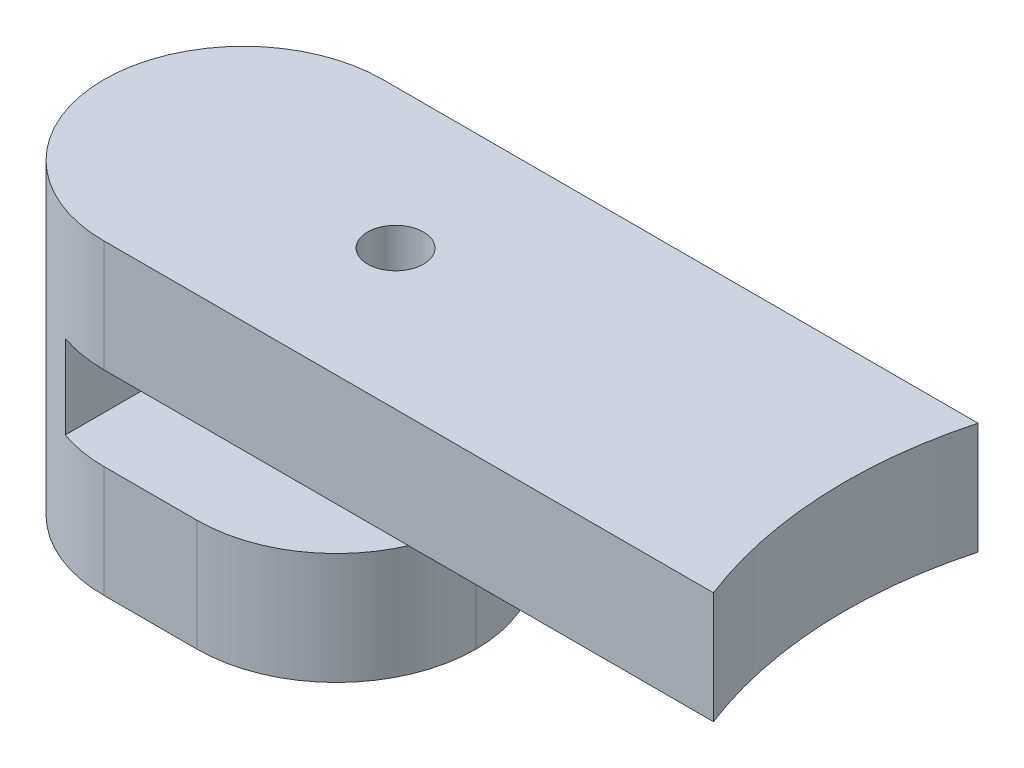
ISO-10303-21;
HEADER;
FILE_DESCRIPTION(('STEP AP214'),'2;1');
FILE_NAME('part.step','',(''),(''),'','','');
FILE_SCHEMA(('AUTOMOTIVE_DESIGN { 1 0 10303 214 1 1 1 1 }'));
ENDSEC;
DATA;
#1=APPLICATION_CONTEXT('core data for automotive mechanical design processes');
#2=APPLICATION_PROTOCOL_DEFINITION('international standard','automotive_design',2000,#1);
#3=PRODUCT_CONTEXT('',#1,'mechanical');
#4=PRODUCT('Part','Part','',(#3));
#5=PRODUCT_RELATED_PRODUCT_CATEGORY('part','',(#4));
#6=PRODUCT_DEFINITION_FORMATION('','',#4);
#7=PRODUCT_DEFINITION_CONTEXT('part definition',#1,'design');
#8=PRODUCT_DEFINITION('design','',#6,#7);
#9=PRODUCT_DEFINITION_SHAPE('','',#8);
#10=(LENGTH_UNIT() NAMED_UNIT(*) SI_UNIT(.MILLI.,.METRE.));
#11=(NAMED_UNIT(*) PLANE_ANGLE_UNIT() SI_UNIT($,.RADIAN.));
#12=(NAMED_UNIT(*) SI_UNIT($,.STERADIAN.) SOLID_ANGLE_UNIT());
#13=UNCERTAINTY_MEASURE_WITH_UNIT(LENGTH_MEASURE(1.E-05),#10,'distance_accuracy_value','');
#14=(GEOMETRIC_REPRESENTATION_CONTEXT(3) GLOBAL_UNCERTAINTY_ASSIGNED_CONTEXT((#13)) GLOBAL_UNIT_ASSIGNED_CONTEXT((#10,
#11,#12)) REPRESENTATION_CONTEXT('',''));
#15=CARTESIAN_POINT('',(0.,0.,0.));
#16=DIRECTION('',(0.,0.,1.));
#17=DIRECTION('',(1.,0.,0.));
#18=AXIS2_PLACEMENT_3D('',#15,#16,#17);
#19=CARTESIAN_POINT('',(0.,3.,3.75));
#20=DIRECTION('',(0.,0.,-1.));
#21=DIRECTION('',(-1.,0.,0.));
#22=AXIS2_PLACEMENT_3D('',#19,#20,#21);
#23=PLANE('',#22);
#24=DIRECTION('',(1.,0.,0.));
#25=VECTOR('',#24,1.);
#26=CARTESIAN_POINT('',(0.,3.,3.75));
#27=LINE('',#26,#25);
#28=CARTESIAN_POINT('',(-4.08744893904425,3.,3.75));
#29=VERTEX_POINT('',#28);
#30=CARTESIAN_POINT('',(12.29141362688,3.,3.75));
#31=VERTEX_POINT('',#30);
#32=EDGE_CURVE('E132',#29,#31,#27,.T.);
#33=ORIENTED_EDGE('',*,*,#32,.F.);
#34=DIRECTION('',(0.,1.,0.));
#35=VECTOR('',#34,1.);
#36=CARTESIAN_POINT('',(-4.08744893904425,-5.25,3.75));
#37=LINE('',#36,#35);
#38=CARTESIAN_POINT('',(-4.08744893904425,0.,3.75));
#39=VERTEX_POINT('',#38);
#40=EDGE_CURVE('E186',#29,#39,#37,.F.);
#41=ORIENTED_EDGE('',*,*,#40,.T.);
#42=DIRECTION('',(1.,0.,0.));
#43=VECTOR('',#42,1.);
#44=CARTESIAN_POINT('',(0.,0.,3.75));
#45=LINE('',#44,#43);
#46=CARTESIAN_POINT('',(12.29141362688,0.,3.75));
#47=VERTEX_POINT('',#46);
#48=EDGE_CURVE('E133',#39,#47,#45,.T.);
#49=ORIENTED_EDGE('',*,*,#48,.T.);
#50=DIRECTION('',(0.,1.,0.));
#51=VECTOR('',#50,1.);
#52=CARTESIAN_POINT('',(12.29141362688,-33.9411254969543,3.75));
#53=LINE('',#52,#51);
#54=EDGE_CURVE('E143',#47,#31,#53,.T.);
#55=ORIENTED_EDGE('',*,*,#54,.T.);
#56=EDGE_LOOP('',(#33,#41,#49,#55));
#57=FACE_BOUND('',#56,.T.);
#58=ADVANCED_FACE('F34',(#57),#23,.F.);
#59=CARTESIAN_POINT('',(0.,3.,-3.75));
#60=DIRECTION('',(0.,0.,-1.));
#61=DIRECTION('',(-1.,0.,0.));
#62=AXIS2_PLACEMENT_3D('',#59,#60,#61);
#63=PLANE('',#62);
#64=DIRECTION('',(-1.,0.,0.));
#65=VECTOR('',#64,1.);
#66=CARTESIAN_POINT('',(2.16255106095575,-2.25,-3.75));
#67=LINE('',#66,#65);
#68=CARTESIAN_POINT('',(-1.58744893904425,-2.25,-3.75));
#69=VERTEX_POINT('',#68);
#70=CARTESIAN_POINT('',(-4.08744893904426,-2.25,-3.75));
#71=VERTEX_POINT('',#70);
#72=EDGE_CURVE('E233',#69,#71,#67,.T.);
#73=ORIENTED_EDGE('',*,*,#72,.F.);
#74=DIRECTION('',(0.,1.,0.));
#75=VECTOR('',#74,1.);
#76=CARTESIAN_POINT('',(-1.58744893904425,-5.25,-3.75));
#77=LINE('',#76,#75);
#78=CARTESIAN_POINT('',(-1.58744893904425,-5.25,-3.74999999999999));
#79=VERTEX_POINT('',#78);
#80=EDGE_CURVE('E173',#69,#79,#77,.F.);
#81=ORIENTED_EDGE('',*,*,#80,.T.);
#82=DIRECTION('',(1.,0.,0.));
#83=VECTOR('',#82,1.);
#84=CARTESIAN_POINT('',(-7.83744893904425,-5.25,-3.75));
#85=LINE('',#84,#83);
#86=CARTESIAN_POINT('',(-4.08744893904426,-5.25,-3.75));
#87=VERTEX_POINT('',#86);
#88=EDGE_CURVE('E222',#87,#79,#85,.T.);
#89=ORIENTED_EDGE('',*,*,#88,.F.);
#90=DIRECTION('',(0.,1.,0.));
#91=VECTOR('',#90,1.);
#92=CARTESIAN_POINT('',(-4.08744893904426,3.,-3.75));
#93=LINE('',#92,#91);
#94=EDGE_CURVE('E171',#87,#71,#93,.T.);
#95=ORIENTED_EDGE('',*,*,#94,.T.);
#96=EDGE_LOOP('',(#73,#81,#89,#95));
#97=FACE_BOUND('',#96,.T.);
#98=ADVANCED_FACE('F226',(#97),#63,.T.);
#99=CARTESIAN_POINT('',(-5.33744893904425,-5.25,3.75));
#100=DIRECTION('',(-1.,0.,0.));
#101=DIRECTION('',(0.,0.,1.));
#102=AXIS2_PLACEMENT_3D('',#99,#100,#101);
#103=PLANE('',#102);
#104=DIRECTION('',(0.,0.,1.));
#105=VECTOR('',#104,1.);
#106=CARTESIAN_POINT('',(-5.33744893904425,0.,3.75));
#107=LINE('',#106,#105);
#108=CARTESIAN_POINT('',(-5.33744893904425,0.,-3.53553390593274));
#109=VERTEX_POINT('',#108);
#110=CARTESIAN_POINT('',(-5.33744893904425,0.,3.53553390593274));
#111=VERTEX_POINT('',#110);
#112=EDGE_CURVE('E230',#109,#111,#107,.T.);
#113=ORIENTED_EDGE('',*,*,#112,.T.);
#114=DIRECTION('',(0.,-1.,0.));
#115=VECTOR('',#114,1.);
#116=CARTESIAN_POINT('',(-5.33744893904425,0.,3.53553390593274));
#117=LINE('',#116,#115);
#118=CARTESIAN_POINT('',(-5.33744893904425,-2.25,3.53553390593274));
#119=VERTEX_POINT('',#118);
#120=EDGE_CURVE('E11',#111,#119,#117,.T.);
#121=ORIENTED_EDGE('',*,*,#120,.T.);
#122=DIRECTION('',(0.,0.,1.));
#123=VECTOR('',#122,1.);
#124=CARTESIAN_POINT('',(-5.33744893904425,-2.25,3.75));
#125=LINE('',#124,#123);
#126=CARTESIAN_POINT('',(-5.33744893904425,-2.25,-3.53553390593274));
#127=VERTEX_POINT('',#126);
#128=EDGE_CURVE('E244',#127,#119,#125,.T.);
#129=ORIENTED_EDGE('',*,*,#128,.F.);
#130=DIRECTION('',(0.,1.,0.));
#131=VECTOR('',#130,1.);
#132=CARTESIAN_POINT('',(-5.33744893904425,-2.25,-3.53553390593274));
#133=LINE('',#132,#131);
#134=EDGE_CURVE('E43',#127,#109,#133,.T.);
#135=ORIENTED_EDGE('',*,*,#134,.T.);
#136=EDGE_LOOP('',(#113,#121,#129,#135));
#137=FACE_BOUND('',#136,.T.);
#138=ADVANCED_FACE('F243',(#137),#103,.F.);
#139=CARTESIAN_POINT('',(0.,0.,0.));
#140=DIRECTION('',(0.,1.,0.));
#141=DIRECTION('',(0.,0.,1.));
#142=AXIS2_PLACEMENT_3D('',#139,#140,#141);
#143=PLANE('',#142);
#144=CARTESIAN_POINT('',(0.,0.,0.));
#145=DIRECTION('',(0.,1.,0.));
#146=DIRECTION('',(0.,0.,1.));
#147=AXIS2_PLACEMENT_3D('',#144,#145,#146);
#148=CIRCLE('',#147,0.75);
#149=CARTESIAN_POINT('',(0.,0.,0.75));
#150=VERTEX_POINT('',#149);
#151=EDGE_CURVE('E160',#150,#150,#148,.T.);
#152=ORIENTED_EDGE('',*,*,#151,.T.);
#153=EDGE_LOOP('',(#152));
#154=FACE_BOUND('',#153,.T.);
#155=ORIENTED_EDGE('',*,*,#48,.F.);
#156=CARTESIAN_POINT('',(-4.08744893904425,0.,0.));
#157=DIRECTION('',(0.,1.,0.));
#158=DIRECTION('',(0.,0.,1.));
#159=AXIS2_PLACEMENT_3D('',#156,#157,#158);
#160=CIRCLE('',#159,3.75);
#161=EDGE_CURVE('E51',#39,#111,#160,.F.);
#162=ORIENTED_EDGE('',*,*,#161,.T.);
#163=ORIENTED_EDGE('',*,*,#112,.F.);
#164=CARTESIAN_POINT('',(-4.08744893904425,0.,0.));
#165=DIRECTION('',(0.,1.,0.));
#166=DIRECTION('',(0.,0.,1.));
#167=AXIS2_PLACEMENT_3D('',#164,#165,#166);
#168=CIRCLE('',#167,3.75);
#169=CARTESIAN_POINT('',(-4.08744893904426,0.,-3.75));
#170=VERTEX_POINT('',#169);
#171=EDGE_CURVE('E128',#109,#170,#168,.F.);
#172=ORIENTED_EDGE('',*,*,#171,.T.);
#173=DIRECTION('',(1.,0.,0.));
#174=VECTOR('',#173,1.);
#175=CARTESIAN_POINT('',(0.,0.,-3.75));
#176=LINE('',#175,#174);
#177=CARTESIAN_POINT('',(11.8980284761821,0.,-3.75000000000001));
#178=VERTEX_POINT('',#177);
#179=EDGE_CURVE('E123',#170,#178,#176,.T.);
#180=ORIENTED_EDGE('',*,*,#179,.T.);
#181=CARTESIAN_POINT('',(23.4763914962315,0.,-0.596984019077557));
#182=DIRECTION('',(0.,1.,0.));
#183=DIRECTION('',(0.,0.,1.));
#184=AXIS2_PLACEMENT_3D('',#181,#182,#183);
#185=CIRCLE('',#184,12.);
#186=EDGE_CURVE('E126',#47,#178,#185,.F.);
#187=ORIENTED_EDGE('',*,*,#186,.F.);
#188=EDGE_LOOP('',(#155,#162,#163,#172,#180,#187));
#189=FACE_BOUND('',#188,.T.);
#190=ADVANCED_FACE('F125',(#154,#189),#143,.F.);
#191=DIRECTION('',(-1.,0.,0.));
#192=VECTOR('',#191,1.);
#193=CARTESIAN_POINT('',(-7.83744893904425,-5.25,3.75));
#194=LINE('',#193,#192);
#195=CARTESIAN_POINT('',(-1.58744893904425,-5.25,3.75));
#196=VERTEX_POINT('',#195);
#197=CARTESIAN_POINT('',(-4.08744893904425,-5.25,3.75));
#198=VERTEX_POINT('',#197);
#199=EDGE_CURVE('E229',#196,#198,#194,.T.);
#200=ORIENTED_EDGE('',*,*,#199,.F.);
#201=DIRECTION('',(0.,-1.,0.));
#202=VECTOR('',#201,1.);
#203=CARTESIAN_POINT('',(-1.58744893904425,3.,3.75));
#204=LINE('',#203,#202);
#205=CARTESIAN_POINT('',(-1.58744893904425,-2.25,3.75000000000001));
#206=VERTEX_POINT('',#205);
#207=EDGE_CURVE('E189',#196,#206,#204,.F.);
#208=ORIENTED_EDGE('',*,*,#207,.T.);
#209=DIRECTION('',(-1.,0.,0.));
#210=VECTOR('',#209,1.);
#211=CARTESIAN_POINT('',(2.16255106095575,-2.25,3.75000000000001));
#212=LINE('',#211,#210);
#213=CARTESIAN_POINT('',(-4.08744893904425,-2.25,3.75));
#214=VERTEX_POINT('',#213);
#215=EDGE_CURVE('E249',#206,#214,#212,.T.);
#216=ORIENTED_EDGE('',*,*,#215,.T.);
#217=DIRECTION('',(0.,1.,0.));
#218=VECTOR('',#217,1.);
#219=CARTESIAN_POINT('',(-4.08744893904425,-5.25,3.75));
#220=LINE('',#219,#218);
#221=EDGE_CURVE('E184',#214,#198,#220,.F.);
#222=ORIENTED_EDGE('',*,*,#221,.T.);
#223=EDGE_LOOP('',(#200,#208,#216,#222));
#224=FACE_BOUND('',#223,.T.);
#225=ADVANCED_FACE('F273',(#224),#23,.F.);
#226=ORIENTED_EDGE('',*,*,#179,.F.);
#227=DIRECTION('',(0.,1.,0.));
#228=VECTOR('',#227,1.);
#229=CARTESIAN_POINT('',(-4.08744893904426,3.,-3.75));
#230=LINE('',#229,#228);
#231=CARTESIAN_POINT('',(-4.08744893904426,3.,-3.75));
#232=VERTEX_POINT('',#231);
#233=EDGE_CURVE('E169',#170,#232,#230,.T.);
#234=ORIENTED_EDGE('',*,*,#233,.T.);
#235=DIRECTION('',(1.,0.,0.));
#236=VECTOR('',#235,1.);
#237=CARTESIAN_POINT('',(0.,3.,-3.75));
#238=LINE('',#237,#236);
#239=CARTESIAN_POINT('',(11.8980284761821,3.,-3.75000000000001));
#240=VERTEX_POINT('',#239);
#241=EDGE_CURVE('E148',#232,#240,#238,.T.);
#242=ORIENTED_EDGE('',*,*,#241,.T.);
#243=DIRECTION('',(0.,1.,0.));
#244=VECTOR('',#243,1.);
#245=CARTESIAN_POINT('',(11.8980284761821,-33.9411254969543,-3.75000000000001));
#246=LINE('',#245,#244);
#247=EDGE_CURVE('E140',#178,#240,#246,.T.);
#248=ORIENTED_EDGE('',*,*,#247,.F.);
#249=EDGE_LOOP('',(#226,#234,#242,#248));
#250=FACE_BOUND('',#249,.T.);
#251=ADVANCED_FACE('F146',(#250),#63,.T.);
#252=CARTESIAN_POINT('',(0.,3.,0.));
#253=DIRECTION('',(0.,1.,0.));
#254=DIRECTION('',(0.,0.,1.));
#255=AXIS2_PLACEMENT_3D('',#252,#253,#254);
#256=PLANE('',#255);
#257=CARTESIAN_POINT('',(0.,3.,0.));
#258=DIRECTION('',(0.,1.,0.));
#259=DIRECTION('',(0.,0.,1.));
#260=AXIS2_PLACEMENT_3D('',#257,#258,#259);
#261=CIRCLE('',#260,0.75);
#262=CARTESIAN_POINT('',(0.,3.,0.75));
#263=VERTEX_POINT('',#262);
#264=EDGE_CURVE('E199',#263,#263,#261,.T.);
#265=ORIENTED_EDGE('',*,*,#264,.F.);
#266=EDGE_LOOP('',(#265));
#267=FACE_BOUND('',#266,.T.);
#268=CARTESIAN_POINT('',(-4.08744893904425,3.,0.));
#269=DIRECTION('',(0.,1.,0.));
#270=DIRECTION('',(0.,0.,1.));
#271=AXIS2_PLACEMENT_3D('',#268,#269,#270);
#272=CIRCLE('',#271,3.75);
#273=CARTESIAN_POINT('',(-7.83744893904425,3.,0.));
#274=VERTEX_POINT('',#273);
#275=EDGE_CURVE('E191',#232,#274,#272,.T.);
#276=ORIENTED_EDGE('',*,*,#275,.T.);
#277=CARTESIAN_POINT('',(-4.08744893904425,3.,0.));
#278=DIRECTION('',(0.,1.,0.));
#279=DIRECTION('',(0.,0.,1.));
#280=AXIS2_PLACEMENT_3D('',#277,#278,#279);
#281=CIRCLE('',#280,3.75);
#282=EDGE_CURVE('E193',#274,#29,#281,.T.);
#283=ORIENTED_EDGE('',*,*,#282,.T.);
#284=ORIENTED_EDGE('',*,*,#32,.T.);
#285=CARTESIAN_POINT('',(23.4763914962315,3.,-0.596984019077557));
#286=DIRECTION('',(0.,1.,0.));
#287=DIRECTION('',(0.,0.,1.));
#288=AXIS2_PLACEMENT_3D('',#285,#286,#287);
#289=CIRCLE('',#288,12.);
#290=EDGE_CURVE('E144',#240,#31,#289,.T.);
#291=ORIENTED_EDGE('',*,*,#290,.F.);
#292=ORIENTED_EDGE('',*,*,#241,.F.);
#293=EDGE_LOOP('',(#276,#283,#284,#291,#292));
#294=FACE_BOUND('',#293,.T.);
#295=ADVANCED_FACE('F285',(#267,#294),#256,.T.);
#296=CARTESIAN_POINT('',(23.4763914962315,-33.9411254969543,-0.596984019077557));
#297=DIRECTION('',(0.,1.,0.));
#298=DIRECTION('',(0.,0.,1.));
#299=AXIS2_PLACEMENT_3D('',#296,#297,#298);
#300=CYLINDRICAL_SURFACE('',#299,12.);
#301=ORIENTED_EDGE('',*,*,#186,.T.);
#302=ORIENTED_EDGE('',*,*,#247,.T.);
#303=ORIENTED_EDGE('',*,*,#290,.T.);
#304=ORIENTED_EDGE('',*,*,#54,.F.);
#305=EDGE_LOOP('',(#301,#302,#303,#304));
#306=FACE_BOUND('',#305,.T.);
#307=ADVANCED_FACE('F138',(#306),#300,.F.);
#308=CARTESIAN_POINT('',(0.,-5.25,0.));
#309=DIRECTION('',(0.,-1.,0.));
#310=DIRECTION('',(0.,0.,-1.));
#311=AXIS2_PLACEMENT_3D('',#308,#309,#310);
#312=PLANE('',#311);
#313=CARTESIAN_POINT('',(0.,-5.25,0.));
#314=DIRECTION('',(0.,-1.,0.));
#315=DIRECTION('',(0.,0.,-1.));
#316=AXIS2_PLACEMENT_3D('',#313,#314,#315);
#317=CIRCLE('',#316,0.75);
#318=CARTESIAN_POINT('',(0.,-5.25,-0.75));
#319=VERTEX_POINT('',#318);
#320=EDGE_CURVE('E161',#319,#319,#317,.F.);
#321=ORIENTED_EDGE('',*,*,#320,.T.);
#322=EDGE_LOOP('',(#321));
#323=FACE_BOUND('',#322,.T.);
#324=ORIENTED_EDGE('',*,*,#88,.T.);
#325=CARTESIAN_POINT('',(-1.58744893904425,-5.25,0.));
#326=DIRECTION('',(0.,-1.,0.));
#327=DIRECTION('',(0.,0.,-1.));
#328=AXIS2_PLACEMENT_3D('',#325,#326,#327);
#329=CIRCLE('',#328,3.75);
#330=CARTESIAN_POINT('',(2.16255106095575,-5.25,0.));
#331=VERTEX_POINT('',#330);
#332=EDGE_CURVE('E182',#79,#331,#329,.T.);
#333=ORIENTED_EDGE('',*,*,#332,.T.);
#334=CARTESIAN_POINT('',(-1.58744893904425,-5.25,0.));
#335=DIRECTION('',(0.,-1.,0.));
#336=DIRECTION('',(0.,0.,-1.));
#337=AXIS2_PLACEMENT_3D('',#334,#335,#336);
#338=CIRCLE('',#337,3.75);
#339=EDGE_CURVE('E180',#331,#196,#338,.T.);
#340=ORIENTED_EDGE('',*,*,#339,.T.);
#341=ORIENTED_EDGE('',*,*,#199,.T.);
#342=CARTESIAN_POINT('',(-4.08744893904425,-5.25,0.));
#343=DIRECTION('',(0.,-1.,0.));
#344=DIRECTION('',(0.,0.,-1.));
#345=AXIS2_PLACEMENT_3D('',#342,#343,#344);
#346=CIRCLE('',#345,3.75);
#347=CARTESIAN_POINT('',(-7.83744893904425,-5.25,0.));
#348=VERTEX_POINT('',#347);
#349=EDGE_CURVE('E178',#198,#348,#346,.T.);
#350=ORIENTED_EDGE('',*,*,#349,.T.);
#351=CARTESIAN_POINT('',(-4.08744893904425,-5.25,0.));
#352=DIRECTION('',(0.,-1.,0.));
#353=DIRECTION('',(0.,0.,-1.));
#354=AXIS2_PLACEMENT_3D('',#351,#352,#353);
#355=CIRCLE('',#354,3.75);
#356=EDGE_CURVE('E176',#348,#87,#355,.T.);
#357=ORIENTED_EDGE('',*,*,#356,.T.);
#358=EDGE_LOOP('',(#324,#333,#340,#341,#350,#357));
#359=FACE_BOUND('',#358,.T.);
#360=ADVANCED_FACE('F221',(#323,#359),#312,.T.);
#361=CARTESIAN_POINT('',(2.16255106095575,-2.25,3.75000000000001));
#362=DIRECTION('',(0.,-1.,0.));
#363=DIRECTION('',(0.,0.,-1.));
#364=AXIS2_PLACEMENT_3D('',#361,#362,#363);
#365=PLANE('',#364);
#366=CARTESIAN_POINT('',(0.,-2.25,0.));
#367=DIRECTION('',(0.,-1.,0.));
#368=DIRECTION('',(0.,0.,-1.));
#369=AXIS2_PLACEMENT_3D('',#366,#367,#368);
#370=CIRCLE('',#369,0.75);
#371=CARTESIAN_POINT('',(0.,-2.25,-0.75));
#372=VERTEX_POINT('',#371);
#373=EDGE_CURVE('E157',#372,#372,#370,.T.);
#374=ORIENTED_EDGE('',*,*,#373,.T.);
#375=EDGE_LOOP('',(#374));
#376=FACE_BOUND('',#375,.T.);
#377=CARTESIAN_POINT('',(-1.58744893904425,-2.25,0.));
#378=DIRECTION('',(0.,-1.,0.));
#379=DIRECTION('',(0.,0.,-1.));
#380=AXIS2_PLACEMENT_3D('',#377,#378,#379);
#381=CIRCLE('',#380,3.75);
#382=CARTESIAN_POINT('',(2.16255106095575,-2.25,0.));
#383=VERTEX_POINT('',#382);
#384=EDGE_CURVE('E165',#206,#383,#381,.F.);
#385=ORIENTED_EDGE('',*,*,#384,.T.);
#386=CARTESIAN_POINT('',(-1.58744893904425,-2.25,0.));
#387=DIRECTION('',(0.,-1.,0.));
#388=DIRECTION('',(0.,0.,-1.));
#389=AXIS2_PLACEMENT_3D('',#386,#387,#388);
#390=CIRCLE('',#389,3.75);
#391=EDGE_CURVE('E167',#383,#69,#390,.F.);
#392=ORIENTED_EDGE('',*,*,#391,.T.);
#393=ORIENTED_EDGE('',*,*,#72,.T.);
#394=CARTESIAN_POINT('',(-4.08744893904425,-2.25,0.));
#395=DIRECTION('',(0.,-1.,0.));
#396=DIRECTION('',(0.,0.,-1.));
#397=AXIS2_PLACEMENT_3D('',#394,#395,#396);
#398=CIRCLE('',#397,3.75);
#399=EDGE_CURVE('E155',#71,#127,#398,.F.);
#400=ORIENTED_EDGE('',*,*,#399,.T.);
#401=ORIENTED_EDGE('',*,*,#128,.T.);
#402=CARTESIAN_POINT('',(-4.08744893904425,-2.25,0.));
#403=DIRECTION('',(0.,-1.,0.));
#404=DIRECTION('',(0.,0.,-1.));
#405=AXIS2_PLACEMENT_3D('',#402,#403,#404);
#406=CIRCLE('',#405,3.75);
#407=EDGE_CURVE('E163',#119,#214,#406,.F.);
#408=ORIENTED_EDGE('',*,*,#407,.T.);
#409=ORIENTED_EDGE('',*,*,#215,.F.);
#410=EDGE_LOOP('',(#385,#392,#393,#400,#401,#408,#409));
#411=FACE_BOUND('',#410,.T.);
#412=ADVANCED_FACE('F246',(#376,#411),#365,.F.);
#413=CARTESIAN_POINT('',(0.,-7.37132034355964,0.));
#414=DIRECTION('',(0.,1.,0.));
#415=DIRECTION('',(0.,0.,1.));
#416=AXIS2_PLACEMENT_3D('',#413,#414,#415);
#417=CYLINDRICAL_SURFACE('',#416,0.75);
#418=ORIENTED_EDGE('',*,*,#320,.F.);
#419=EDGE_LOOP('',(#418));
#420=FACE_BOUND('',#419,.T.);
#421=ORIENTED_EDGE('',*,*,#373,.F.);
#422=EDGE_LOOP('',(#421));
#423=FACE_BOUND('',#422,.T.);
#424=ADVANCED_FACE('F258',(#420,#423),#417,.F.);
#425=ORIENTED_EDGE('',*,*,#264,.T.);
#426=EDGE_LOOP('',(#425));
#427=FACE_BOUND('',#426,.T.);
#428=ORIENTED_EDGE('',*,*,#151,.F.);
#429=EDGE_LOOP('',(#428));
#430=FACE_BOUND('',#429,.T.);
#431=ADVANCED_FACE('F261',(#427,#430),#417,.F.);
#432=CARTESIAN_POINT('',(-1.58744893904425,0.,0.));
#433=DIRECTION('',(0.,-1.,0.));
#434=DIRECTION('',(0.,0.,-1.));
#435=AXIS2_PLACEMENT_3D('',#432,#433,#434);
#436=CYLINDRICAL_SURFACE('',#435,3.75);
#437=ORIENTED_EDGE('',*,*,#207,.F.);
#438=ORIENTED_EDGE('',*,*,#339,.F.);
#439=DIRECTION('',(0.,-1.,0.));
#440=VECTOR('',#439,1.);
#441=CARTESIAN_POINT('',(2.16255106095575,0.,0.));
#442=LINE('',#441,#440);
#443=EDGE_CURVE('E197',#383,#331,#442,.T.);
#444=ORIENTED_EDGE('',*,*,#443,.F.);
#445=ORIENTED_EDGE('',*,*,#384,.F.);
#446=EDGE_LOOP('',(#437,#438,#444,#445));
#447=FACE_BOUND('',#446,.T.);
#448=ADVANCED_FACE('F293',(#447),#436,.T.);
#449=CARTESIAN_POINT('',(-1.58744893904425,0.,0.));
#450=DIRECTION('',(0.,-1.,0.));
#451=DIRECTION('',(0.,0.,-1.));
#452=AXIS2_PLACEMENT_3D('',#449,#450,#451);
#453=CYLINDRICAL_SURFACE('',#452,3.75);
#454=ORIENTED_EDGE('',*,*,#332,.F.);
#455=ORIENTED_EDGE('',*,*,#80,.F.);
#456=ORIENTED_EDGE('',*,*,#391,.F.);
#457=ORIENTED_EDGE('',*,*,#443,.T.);
#458=EDGE_LOOP('',(#454,#455,#456,#457));
#459=FACE_BOUND('',#458,.T.);
#460=ADVANCED_FACE('F294',(#459),#453,.T.);
#461=CARTESIAN_POINT('',(-4.08744893904425,3.,0.));
#462=DIRECTION('',(0.,1.,0.));
#463=DIRECTION('',(0.,0.,1.));
#464=AXIS2_PLACEMENT_3D('',#461,#462,#463);
#465=CYLINDRICAL_SURFACE('',#464,3.75);
#466=ORIENTED_EDGE('',*,*,#94,.F.);
#467=ORIENTED_EDGE('',*,*,#356,.F.);
#468=DIRECTION('',(0.,1.,0.));
#469=VECTOR('',#468,1.);
#470=CARTESIAN_POINT('',(-7.83744893904425,-10.8478387650318,0.));
#471=LINE('',#470,#469);
#472=EDGE_CURVE('E38',#274,#348,#471,.F.);
#473=ORIENTED_EDGE('',*,*,#472,.F.);
#474=ORIENTED_EDGE('',*,*,#275,.F.);
#475=ORIENTED_EDGE('',*,*,#233,.F.);
#476=ORIENTED_EDGE('',*,*,#171,.F.);
#477=ORIENTED_EDGE('',*,*,#134,.F.);
#478=ORIENTED_EDGE('',*,*,#399,.F.);
#479=EDGE_LOOP('',(#466,#467,#473,#474,#475,#476,#477,#478));
#480=FACE_BOUND('',#479,.T.);
#481=ADVANCED_FACE('F36',(#480),#465,.T.);
#482=CARTESIAN_POINT('',(-4.08744893904425,-10.8478387650318,0.));
#483=DIRECTION('',(0.,-1.,0.));
#484=DIRECTION('',(0.,0.,-1.));
#485=AXIS2_PLACEMENT_3D('',#482,#483,#484);
#486=CYLINDRICAL_SURFACE('',#485,3.75);
#487=ORIENTED_EDGE('',*,*,#161,.F.);
#488=ORIENTED_EDGE('',*,*,#40,.F.);
#489=ORIENTED_EDGE('',*,*,#282,.F.);
#490=ORIENTED_EDGE('',*,*,#472,.T.);
#491=ORIENTED_EDGE('',*,*,#349,.F.);
#492=ORIENTED_EDGE('',*,*,#221,.F.);
#493=ORIENTED_EDGE('',*,*,#407,.F.);
#494=ORIENTED_EDGE('',*,*,#120,.F.);
#495=EDGE_LOOP('',(#487,#488,#489,#490,#491,#492,#493,#494));
#496=FACE_BOUND('',#495,.T.);
#497=ADVANCED_FACE('F210',(#496),#486,.T.);
#498=CLOSED_SHELL('',(#58,#98,#138,#190,#225,#251,#295,#307,#360,#412,#424,#431,#448,#460,#481,#497));
#499=MANIFOLD_SOLID_BREP('B2',#498);
#500=ADVANCED_BREP_SHAPE_REPRESENTATION('',(#18,#499),#14);
#501=SHAPE_DEFINITION_REPRESENTATION(#9,#500);
ENDSEC;
END-ISO-10303-21;
